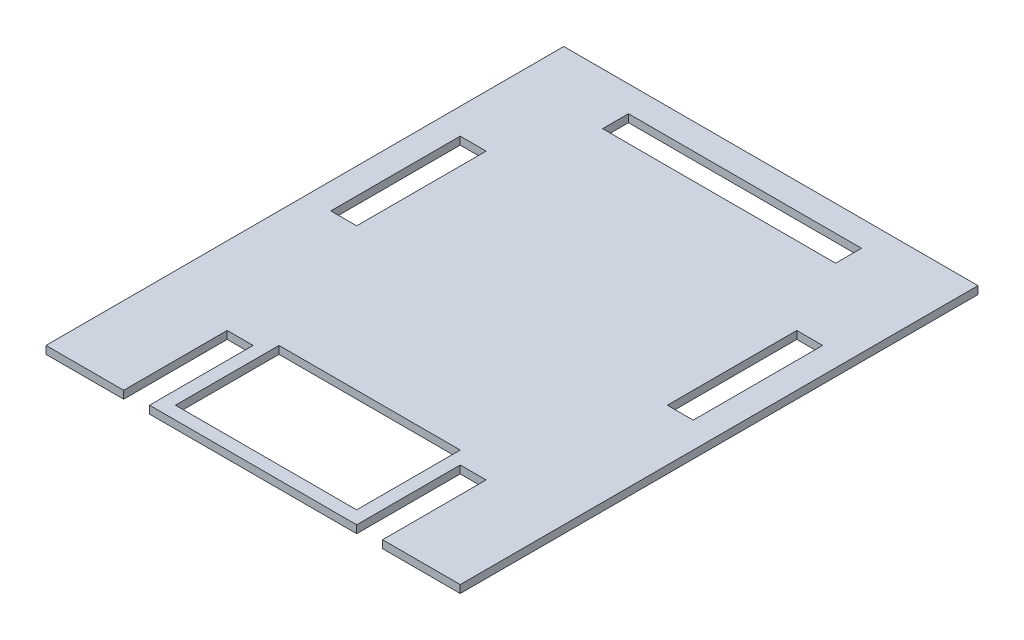
ISO-10303-21;
HEADER;
FILE_DESCRIPTION(('STEP AP214'),'2;1');
FILE_NAME('part.step','',(''),(''),'','','');
FILE_SCHEMA(('AUTOMOTIVE_DESIGN { 1 0 10303 214 1 1 1 1 }'));
ENDSEC;
DATA;
#1=APPLICATION_CONTEXT('core data for automotive mechanical design processes');
#2=APPLICATION_PROTOCOL_DEFINITION('international standard','automotive_design',2000,#1);
#3=PRODUCT_CONTEXT('',#1,'mechanical');
#4=PRODUCT('Part','Part','',(#3));
#5=PRODUCT_RELATED_PRODUCT_CATEGORY('part','',(#4));
#6=PRODUCT_DEFINITION_FORMATION('','',#4);
#7=PRODUCT_DEFINITION_CONTEXT('part definition',#1,'design');
#8=PRODUCT_DEFINITION('design','',#6,#7);
#9=PRODUCT_DEFINITION_SHAPE('','',#8);
#10=(LENGTH_UNIT() NAMED_UNIT(*) SI_UNIT(.MILLI.,.METRE.));
#11=(NAMED_UNIT(*) PLANE_ANGLE_UNIT() SI_UNIT($,.RADIAN.));
#12=(NAMED_UNIT(*) SI_UNIT($,.STERADIAN.) SOLID_ANGLE_UNIT());
#13=UNCERTAINTY_MEASURE_WITH_UNIT(LENGTH_MEASURE(1.E-05),#10,'distance_accuracy_value','');
#14=(GEOMETRIC_REPRESENTATION_CONTEXT(3) GLOBAL_UNCERTAINTY_ASSIGNED_CONTEXT((#13)) GLOBAL_UNIT_ASSIGNED_CONTEXT((#10,
#11,#12)) REPRESENTATION_CONTEXT('',''));
#15=CARTESIAN_POINT('',(0.,0.,0.));
#16=DIRECTION('',(0.,0.,1.));
#17=DIRECTION('',(1.,0.,0.));
#18=AXIS2_PLACEMENT_3D('',#15,#16,#17);
#19=CARTESIAN_POINT('',(0.,3.,-41.2685337726524));
#20=DIRECTION('',(0.,0.,1.));
#21=DIRECTION('',(1.,0.,0.));
#22=AXIS2_PLACEMENT_3D('',#19,#20,#21);
#23=PLANE('',#22);
#24=DIRECTION('',(-1.,0.,0.));
#25=VECTOR('',#24,1.);
#26=CARTESIAN_POINT('',(0.,0.,-41.2685337726524));
#27=LINE('',#26,#25);
#28=CARTESIAN_POINT('',(-89.0609555189457,0.,-41.2685337726524));
#29=VERTEX_POINT('',#28);
#30=CARTESIAN_POINT('',(-99.0609555189457,0.,-41.2685337726524));
#31=VERTEX_POINT('',#30);
#32=EDGE_CURVE('E385',#29,#31,#27,.T.);
#33=ORIENTED_EDGE('',*,*,#32,.F.);
#34=DIRECTION('',(0.,-1.,0.));
#35=VECTOR('',#34,1.);
#36=CARTESIAN_POINT('',(-89.0609555189457,3.,-41.2685337726524));
#37=LINE('',#36,#35);
#38=CARTESIAN_POINT('',(-89.0609555189457,3.,-41.2685337726524));
#39=VERTEX_POINT('',#38);
#40=EDGE_CURVE('E11',#39,#29,#37,.T.);
#41=ORIENTED_EDGE('',*,*,#40,.F.);
#42=DIRECTION('',(-1.,0.,0.));
#43=VECTOR('',#42,1.);
#44=CARTESIAN_POINT('',(0.,3.,-41.2685337726524));
#45=LINE('',#44,#43);
#46=CARTESIAN_POINT('',(-99.0609555189457,3.,-41.2685337726524));
#47=VERTEX_POINT('',#46);
#48=EDGE_CURVE('E240',#39,#47,#45,.T.);
#49=ORIENTED_EDGE('',*,*,#48,.T.);
#50=DIRECTION('',(0.,-1.,0.));
#51=VECTOR('',#50,1.);
#52=CARTESIAN_POINT('',(-99.0609555189457,3.,-41.2685337726524));
#53=LINE('',#52,#51);
#54=EDGE_CURVE('E54',#47,#31,#53,.T.);
#55=ORIENTED_EDGE('',*,*,#54,.T.);
#56=EDGE_LOOP('',(#33,#41,#49,#55));
#57=FACE_BOUND('',#56,.T.);
#58=ADVANCED_FACE('F35',(#57),#23,.T.);
#59=CARTESIAN_POINT('',(-89.0609555189457,3.,0.));
#60=DIRECTION('',(1.,0.,0.));
#61=DIRECTION('',(0.,0.,-1.));
#62=AXIS2_PLACEMENT_3D('',#59,#60,#61);
#63=PLANE('',#62);
#64=DIRECTION('',(0.,0.,1.));
#65=VECTOR('',#64,1.);
#66=CARTESIAN_POINT('',(-89.0609555189457,0.,0.));
#67=LINE('',#66,#65);
#68=CARTESIAN_POINT('',(-89.0609555189457,0.,8.73146622734762));
#69=VERTEX_POINT('',#68);
#70=EDGE_CURVE('E245',#29,#69,#67,.T.);
#71=ORIENTED_EDGE('',*,*,#70,.T.);
#72=DIRECTION('',(0.,-1.,0.));
#73=VECTOR('',#72,1.);
#74=CARTESIAN_POINT('',(-89.0609555189457,3.,8.73146622734762));
#75=LINE('',#74,#73);
#76=CARTESIAN_POINT('',(-89.0609555189457,3.,8.73146622734762));
#77=VERTEX_POINT('',#76);
#78=EDGE_CURVE('E45',#77,#69,#75,.T.);
#79=ORIENTED_EDGE('',*,*,#78,.F.);
#80=DIRECTION('',(0.,0.,1.));
#81=VECTOR('',#80,1.);
#82=CARTESIAN_POINT('',(-89.0609555189457,3.,0.));
#83=LINE('',#82,#81);
#84=EDGE_CURVE('E235',#39,#77,#83,.T.);
#85=ORIENTED_EDGE('',*,*,#84,.F.);
#86=ORIENTED_EDGE('',*,*,#40,.T.);
#87=EDGE_LOOP('',(#71,#79,#85,#86));
#88=FACE_BOUND('',#87,.T.);
#89=ADVANCED_FACE('F243',(#88),#63,.F.);
#90=CARTESIAN_POINT('',(0.,3.,8.73146622734762));
#91=DIRECTION('',(0.,0.,1.));
#92=DIRECTION('',(1.,0.,0.));
#93=AXIS2_PLACEMENT_3D('',#90,#91,#92);
#94=PLANE('',#93);
#95=DIRECTION('',(-1.,0.,0.));
#96=VECTOR('',#95,1.);
#97=CARTESIAN_POINT('',(0.,0.,8.73146622734762));
#98=LINE('',#97,#96);
#99=CARTESIAN_POINT('',(-99.0609555189457,0.,8.73146622734762));
#100=VERTEX_POINT('',#99);
#101=EDGE_CURVE('E388',#69,#100,#98,.T.);
#102=ORIENTED_EDGE('',*,*,#101,.T.);
#103=DIRECTION('',(0.,-1.,0.));
#104=VECTOR('',#103,1.);
#105=CARTESIAN_POINT('',(-99.0609555189457,3.,8.73146622734762));
#106=LINE('',#105,#104);
#107=CARTESIAN_POINT('',(-99.0609555189457,3.,8.73146622734762));
#108=VERTEX_POINT('',#107);
#109=EDGE_CURVE('E140',#108,#100,#106,.T.);
#110=ORIENTED_EDGE('',*,*,#109,.F.);
#111=DIRECTION('',(-1.,0.,0.));
#112=VECTOR('',#111,1.);
#113=CARTESIAN_POINT('',(0.,3.,8.73146622734762));
#114=LINE('',#113,#112);
#115=EDGE_CURVE('E227',#77,#108,#114,.T.);
#116=ORIENTED_EDGE('',*,*,#115,.F.);
#117=ORIENTED_EDGE('',*,*,#78,.T.);
#118=EDGE_LOOP('',(#102,#110,#116,#117));
#119=FACE_BOUND('',#118,.T.);
#120=ADVANCED_FACE('F229',(#119),#94,.F.);
#121=CARTESIAN_POINT('',(0.,3.,-91.2685337726524));
#122=DIRECTION('',(0.,0.,-1.));
#123=DIRECTION('',(-1.,0.,0.));
#124=AXIS2_PLACEMENT_3D('',#121,#122,#123);
#125=PLANE('',#124);
#126=DIRECTION('',(1.,0.,0.));
#127=VECTOR('',#126,1.);
#128=CARTESIAN_POINT('',(0.,0.,-91.2685337726524));
#129=LINE('',#128,#127);
#130=CARTESIAN_POINT('',(-109.060955518946,0.,-91.2685337726524));
#131=VERTEX_POINT('',#130);
#132=CARTESIAN_POINT('',(50.9390444810544,0.,-91.2685337726524));
#133=VERTEX_POINT('',#132);
#134=EDGE_CURVE('E351',#131,#133,#129,.T.);
#135=ORIENTED_EDGE('',*,*,#134,.F.);
#136=DIRECTION('',(0.,-1.,0.));
#137=VECTOR('',#136,1.);
#138=CARTESIAN_POINT('',(-109.060955518946,3.,-91.2685337726524));
#139=LINE('',#138,#137);
#140=CARTESIAN_POINT('',(-109.060955518946,3.,-91.2685337726524));
#141=VERTEX_POINT('',#140);
#142=EDGE_CURVE('E277',#141,#131,#139,.T.);
#143=ORIENTED_EDGE('',*,*,#142,.F.);
#144=DIRECTION('',(1.,0.,0.));
#145=VECTOR('',#144,1.);
#146=CARTESIAN_POINT('',(0.,3.,-91.2685337726524));
#147=LINE('',#146,#145);
#148=CARTESIAN_POINT('',(50.9390444810544,3.,-91.2685337726524));
#149=VERTEX_POINT('',#148);
#150=EDGE_CURVE('E425',#141,#149,#147,.T.);
#151=ORIENTED_EDGE('',*,*,#150,.T.);
#152=DIRECTION('',(0.,-1.,0.));
#153=VECTOR('',#152,1.);
#154=CARTESIAN_POINT('',(50.9390444810544,3.,-91.2685337726524));
#155=LINE('',#154,#153);
#156=EDGE_CURVE('E250',#149,#133,#155,.T.);
#157=ORIENTED_EDGE('',*,*,#156,.T.);
#158=EDGE_LOOP('',(#135,#143,#151,#157));
#159=FACE_BOUND('',#158,.T.);
#160=ADVANCED_FACE('F522',(#159),#125,.T.);
#161=CARTESIAN_POINT('',(-109.060955518946,3.,0.));
#162=DIRECTION('',(1.,0.,0.));
#163=DIRECTION('',(0.,0.,-1.));
#164=AXIS2_PLACEMENT_3D('',#161,#162,#163);
#165=PLANE('',#164);
#166=DIRECTION('',(0.,0.,1.));
#167=VECTOR('',#166,1.);
#168=CARTESIAN_POINT('',(-109.060955518946,0.,0.));
#169=LINE('',#168,#167);
#170=CARTESIAN_POINT('',(-109.060955518946,0.,108.731466227348));
#171=VERTEX_POINT('',#170);
#172=EDGE_CURVE('E354',#131,#171,#169,.T.);
#173=ORIENTED_EDGE('',*,*,#172,.T.);
#174=DIRECTION('',(0.,-1.,0.));
#175=VECTOR('',#174,1.);
#176=CARTESIAN_POINT('',(-109.060955518946,3.,108.731466227348));
#177=LINE('',#176,#175);
#178=CARTESIAN_POINT('',(-109.060955518946,3.,108.731466227348));
#179=VERTEX_POINT('',#178);
#180=EDGE_CURVE('E274',#179,#171,#177,.T.);
#181=ORIENTED_EDGE('',*,*,#180,.F.);
#182=DIRECTION('',(0.,0.,1.));
#183=VECTOR('',#182,1.);
#184=CARTESIAN_POINT('',(-109.060955518946,3.,0.));
#185=LINE('',#184,#183);
#186=EDGE_CURVE('E428',#141,#179,#185,.T.);
#187=ORIENTED_EDGE('',*,*,#186,.F.);
#188=ORIENTED_EDGE('',*,*,#142,.T.);
#189=EDGE_LOOP('',(#173,#181,#187,#188));
#190=FACE_BOUND('',#189,.T.);
#191=ADVANCED_FACE('F518',(#190),#165,.F.);
#192=CARTESIAN_POINT('',(0.,3.,108.731466227348));
#193=DIRECTION('',(0.,0.,-1.));
#194=DIRECTION('',(-1.,0.,0.));
#195=AXIS2_PLACEMENT_3D('',#192,#193,#194);
#196=PLANE('',#195);
#197=DIRECTION('',(1.,0.,0.));
#198=VECTOR('',#197,1.);
#199=CARTESIAN_POINT('',(0.,0.,108.731466227348));
#200=LINE('',#199,#198);
#201=CARTESIAN_POINT('',(-79.0609555189456,0.,108.731466227348));
#202=VERTEX_POINT('',#201);
#203=EDGE_CURVE('E357',#171,#202,#200,.T.);
#204=ORIENTED_EDGE('',*,*,#203,.T.);
#205=DIRECTION('',(0.,-1.,0.));
#206=VECTOR('',#205,1.);
#207=CARTESIAN_POINT('',(-79.0609555189456,3.,108.731466227348));
#208=LINE('',#207,#206);
#209=CARTESIAN_POINT('',(-79.0609555189456,3.,108.731466227348));
#210=VERTEX_POINT('',#209);
#211=EDGE_CURVE('E271',#210,#202,#208,.T.);
#212=ORIENTED_EDGE('',*,*,#211,.F.);
#213=DIRECTION('',(1.,0.,0.));
#214=VECTOR('',#213,1.);
#215=CARTESIAN_POINT('',(0.,3.,108.731466227348));
#216=LINE('',#215,#214);
#217=EDGE_CURVE('E431',#179,#210,#216,.T.);
#218=ORIENTED_EDGE('',*,*,#217,.F.);
#219=ORIENTED_EDGE('',*,*,#180,.T.);
#220=EDGE_LOOP('',(#204,#212,#218,#219));
#221=FACE_BOUND('',#220,.T.);
#222=ADVANCED_FACE('F514',(#221),#196,.F.);
#223=CARTESIAN_POINT('',(-79.0609555189456,3.,0.));
#224=DIRECTION('',(-1.,0.,0.));
#225=DIRECTION('',(0.,0.,1.));
#226=AXIS2_PLACEMENT_3D('',#223,#224,#225);
#227=PLANE('',#226);
#228=DIRECTION('',(0.,0.,-1.));
#229=VECTOR('',#228,1.);
#230=CARTESIAN_POINT('',(-79.0609555189456,0.,0.));
#231=LINE('',#230,#229);
#232=CARTESIAN_POINT('',(-79.0609555189456,0.,68.7314662273476));
#233=VERTEX_POINT('',#232);
#234=EDGE_CURVE('E360',#202,#233,#231,.T.);
#235=ORIENTED_EDGE('',*,*,#234,.T.);
#236=DIRECTION('',(0.,-1.,0.));
#237=VECTOR('',#236,1.);
#238=CARTESIAN_POINT('',(-79.0609555189456,3.,68.7314662273476));
#239=LINE('',#238,#237);
#240=CARTESIAN_POINT('',(-79.0609555189456,3.,68.7314662273476));
#241=VERTEX_POINT('',#240);
#242=EDGE_CURVE('E268',#241,#233,#239,.T.);
#243=ORIENTED_EDGE('',*,*,#242,.F.);
#244=DIRECTION('',(0.,0.,-1.));
#245=VECTOR('',#244,1.);
#246=CARTESIAN_POINT('',(-79.0609555189456,3.,0.));
#247=LINE('',#246,#245);
#248=EDGE_CURVE('E434',#210,#241,#247,.T.);
#249=ORIENTED_EDGE('',*,*,#248,.F.);
#250=ORIENTED_EDGE('',*,*,#211,.T.);
#251=EDGE_LOOP('',(#235,#243,#249,#250));
#252=FACE_BOUND('',#251,.T.);
#253=ADVANCED_FACE('F510',(#252),#227,.F.);
#254=CARTESIAN_POINT('',(0.,3.,68.7314662273476));
#255=DIRECTION('',(0.,0.,-1.));
#256=DIRECTION('',(-1.,0.,0.));
#257=AXIS2_PLACEMENT_3D('',#254,#255,#256);
#258=PLANE('',#257);
#259=DIRECTION('',(1.,0.,0.));
#260=VECTOR('',#259,1.);
#261=CARTESIAN_POINT('',(0.,0.,68.7314662273476));
#262=LINE('',#261,#260);
#263=CARTESIAN_POINT('',(-69.0609555189456,0.,68.7314662273476));
#264=VERTEX_POINT('',#263);
#265=EDGE_CURVE('E363',#233,#264,#262,.T.);
#266=ORIENTED_EDGE('',*,*,#265,.T.);
#267=DIRECTION('',(0.,-1.,0.));
#268=VECTOR('',#267,1.);
#269=CARTESIAN_POINT('',(-69.0609555189456,3.,68.7314662273476));
#270=LINE('',#269,#268);
#271=CARTESIAN_POINT('',(-69.0609555189456,3.,68.7314662273476));
#272=VERTEX_POINT('',#271);
#273=EDGE_CURVE('E266',#272,#264,#270,.T.);
#274=ORIENTED_EDGE('',*,*,#273,.F.);
#275=DIRECTION('',(1.,0.,0.));
#276=VECTOR('',#275,1.);
#277=CARTESIAN_POINT('',(0.,3.,68.7314662273476));
#278=LINE('',#277,#276);
#279=EDGE_CURVE('E437',#241,#272,#278,.T.);
#280=ORIENTED_EDGE('',*,*,#279,.F.);
#281=ORIENTED_EDGE('',*,*,#242,.T.);
#282=EDGE_LOOP('',(#266,#274,#280,#281));
#283=FACE_BOUND('',#282,.T.);
#284=ADVANCED_FACE('F506',(#283),#258,.F.);
#285=CARTESIAN_POINT('',(-69.0609555189456,3.,0.));
#286=DIRECTION('',(-1.,0.,0.));
#287=DIRECTION('',(0.,0.,1.));
#288=AXIS2_PLACEMENT_3D('',#285,#286,#287);
#289=PLANE('',#288);
#290=DIRECTION('',(0.,0.,-1.));
#291=VECTOR('',#290,1.);
#292=CARTESIAN_POINT('',(-69.0609555189456,0.,0.));
#293=LINE('',#292,#291);
#294=CARTESIAN_POINT('',(-69.0609555189456,0.,108.731466227348));
#295=VERTEX_POINT('',#294);
#296=EDGE_CURVE('E366',#295,#264,#293,.T.);
#297=ORIENTED_EDGE('',*,*,#296,.F.);
#298=DIRECTION('',(0.,-1.,0.));
#299=VECTOR('',#298,1.);
#300=CARTESIAN_POINT('',(-69.0609555189456,3.,108.731466227348));
#301=LINE('',#300,#299);
#302=CARTESIAN_POINT('',(-69.0609555189456,3.,108.731466227348));
#303=VERTEX_POINT('',#302);
#304=EDGE_CURVE('E264',#303,#295,#301,.T.);
#305=ORIENTED_EDGE('',*,*,#304,.F.);
#306=DIRECTION('',(0.,0.,-1.));
#307=VECTOR('',#306,1.);
#308=CARTESIAN_POINT('',(-69.0609555189456,3.,0.));
#309=LINE('',#308,#307);
#310=EDGE_CURVE('E439',#303,#272,#309,.T.);
#311=ORIENTED_EDGE('',*,*,#310,.T.);
#312=ORIENTED_EDGE('',*,*,#273,.T.);
#313=EDGE_LOOP('',(#297,#305,#311,#312));
#314=FACE_BOUND('',#313,.T.);
#315=ADVANCED_FACE('F503',(#314),#289,.T.);
#316=CARTESIAN_POINT('',(0.,3.,108.731466227348));
#317=DIRECTION('',(0.,0.,-1.));
#318=DIRECTION('',(-1.,0.,0.));
#319=AXIS2_PLACEMENT_3D('',#316,#317,#318);
#320=PLANE('',#319);
#321=DIRECTION('',(1.,0.,0.));
#322=VECTOR('',#321,1.);
#323=CARTESIAN_POINT('',(0.,0.,108.731466227348));
#324=LINE('',#323,#322);
#325=CARTESIAN_POINT('',(10.9390444810543,0.,108.731466227348));
#326=VERTEX_POINT('',#325);
#327=EDGE_CURVE('E369',#295,#326,#324,.T.);
#328=ORIENTED_EDGE('',*,*,#327,.T.);
#329=DIRECTION('',(0.,-1.,0.));
#330=VECTOR('',#329,1.);
#331=CARTESIAN_POINT('',(10.9390444810543,3.,108.731466227348));
#332=LINE('',#331,#330);
#333=CARTESIAN_POINT('',(10.9390444810543,3.,108.731466227348));
#334=VERTEX_POINT('',#333);
#335=EDGE_CURVE('E261',#334,#326,#332,.T.);
#336=ORIENTED_EDGE('',*,*,#335,.F.);
#337=DIRECTION('',(1.,0.,0.));
#338=VECTOR('',#337,1.);
#339=CARTESIAN_POINT('',(0.,3.,108.731466227348));
#340=LINE('',#339,#338);
#341=EDGE_CURVE('E442',#303,#334,#340,.T.);
#342=ORIENTED_EDGE('',*,*,#341,.F.);
#343=ORIENTED_EDGE('',*,*,#304,.T.);
#344=EDGE_LOOP('',(#328,#336,#342,#343));
#345=FACE_BOUND('',#344,.T.);
#346=ADVANCED_FACE('F491',(#345),#320,.F.);
#347=CARTESIAN_POINT('',(10.9390444810543,3.,0.));
#348=DIRECTION('',(-1.,0.,0.));
#349=DIRECTION('',(0.,0.,1.));
#350=AXIS2_PLACEMENT_3D('',#347,#348,#349);
#351=PLANE('',#350);
#352=DIRECTION('',(0.,0.,-1.));
#353=VECTOR('',#352,1.);
#354=CARTESIAN_POINT('',(10.9390444810543,0.,0.));
#355=LINE('',#354,#353);
#356=CARTESIAN_POINT('',(10.9390444810543,0.,68.7314662273476));
#357=VERTEX_POINT('',#356);
#358=EDGE_CURVE('E372',#326,#357,#355,.T.);
#359=ORIENTED_EDGE('',*,*,#358,.T.);
#360=DIRECTION('',(0.,-1.,0.));
#361=VECTOR('',#360,1.);
#362=CARTESIAN_POINT('',(10.9390444810543,3.,68.7314662273476));
#363=LINE('',#362,#361);
#364=CARTESIAN_POINT('',(10.9390444810543,3.,68.7314662273476));
#365=VERTEX_POINT('',#364);
#366=EDGE_CURVE('E259',#365,#357,#363,.T.);
#367=ORIENTED_EDGE('',*,*,#366,.F.);
#368=DIRECTION('',(0.,0.,-1.));
#369=VECTOR('',#368,1.);
#370=CARTESIAN_POINT('',(10.9390444810543,3.,0.));
#371=LINE('',#370,#369);
#372=EDGE_CURVE('E445',#334,#365,#371,.T.);
#373=ORIENTED_EDGE('',*,*,#372,.F.);
#374=ORIENTED_EDGE('',*,*,#335,.T.);
#375=EDGE_LOOP('',(#359,#367,#373,#374));
#376=FACE_BOUND('',#375,.T.);
#377=ADVANCED_FACE('F498',(#376),#351,.F.);
#378=CARTESIAN_POINT('',(0.,3.,68.7314662273476));
#379=DIRECTION('',(0.,0.,1.));
#380=DIRECTION('',(1.,0.,0.));
#381=AXIS2_PLACEMENT_3D('',#378,#379,#380);
#382=PLANE('',#381);
#383=DIRECTION('',(-1.,0.,0.));
#384=VECTOR('',#383,1.);
#385=CARTESIAN_POINT('',(0.,0.,68.7314662273476));
#386=LINE('',#385,#384);
#387=CARTESIAN_POINT('',(20.9390444810543,0.,68.7314662273476));
#388=VERTEX_POINT('',#387);
#389=EDGE_CURVE('E376',#388,#357,#386,.T.);
#390=ORIENTED_EDGE('',*,*,#389,.F.);
#391=DIRECTION('',(0.,-1.,0.));
#392=VECTOR('',#391,1.);
#393=CARTESIAN_POINT('',(20.9390444810543,3.,68.7314662273476));
#394=LINE('',#393,#392);
#395=CARTESIAN_POINT('',(20.9390444810543,3.,68.7314662273476));
#396=VERTEX_POINT('',#395);
#397=EDGE_CURVE('E257',#396,#388,#394,.T.);
#398=ORIENTED_EDGE('',*,*,#397,.F.);
#399=DIRECTION('',(-1.,0.,0.));
#400=VECTOR('',#399,1.);
#401=CARTESIAN_POINT('',(0.,3.,68.7314662273476));
#402=LINE('',#401,#400);
#403=EDGE_CURVE('E448',#396,#365,#402,.T.);
#404=ORIENTED_EDGE('',*,*,#403,.T.);
#405=ORIENTED_EDGE('',*,*,#366,.T.);
#406=EDGE_LOOP('',(#390,#398,#404,#405));
#407=FACE_BOUND('',#406,.T.);
#408=ADVANCED_FACE('F494',(#407),#382,.T.);
#409=CARTESIAN_POINT('',(20.9390444810543,3.,0.));
#410=DIRECTION('',(-1.,0.,0.));
#411=DIRECTION('',(0.,0.,1.));
#412=AXIS2_PLACEMENT_3D('',#409,#410,#411);
#413=PLANE('',#412);
#414=DIRECTION('',(0.,0.,-1.));
#415=VECTOR('',#414,1.);
#416=CARTESIAN_POINT('',(20.9390444810543,0.,0.));
#417=LINE('',#416,#415);
#418=CARTESIAN_POINT('',(20.9390444810543,0.,108.731466227348));
#419=VERTEX_POINT('',#418);
#420=EDGE_CURVE('E379',#419,#388,#417,.T.);
#421=ORIENTED_EDGE('',*,*,#420,.F.);
#422=DIRECTION('',(0.,-1.,0.));
#423=VECTOR('',#422,1.);
#424=CARTESIAN_POINT('',(20.9390444810543,3.,108.731466227348));
#425=LINE('',#424,#423);
#426=CARTESIAN_POINT('',(20.9390444810543,3.,108.731466227348));
#427=VERTEX_POINT('',#426);
#428=EDGE_CURVE('E255',#427,#419,#425,.T.);
#429=ORIENTED_EDGE('',*,*,#428,.F.);
#430=DIRECTION('',(0.,0.,-1.));
#431=VECTOR('',#430,1.);
#432=CARTESIAN_POINT('',(20.9390444810543,3.,0.));
#433=LINE('',#432,#431);
#434=EDGE_CURVE('E451',#427,#396,#433,.T.);
#435=ORIENTED_EDGE('',*,*,#434,.T.);
#436=ORIENTED_EDGE('',*,*,#397,.T.);
#437=EDGE_LOOP('',(#421,#429,#435,#436));
#438=FACE_BOUND('',#437,.T.);
#439=ADVANCED_FACE('F489',(#438),#413,.T.);
#440=CARTESIAN_POINT('',(50.9390444810544,0.,108.731466227348));
#441=VERTEX_POINT('',#440);
#442=EDGE_CURVE('E373',#419,#441,#324,.T.);
#443=ORIENTED_EDGE('',*,*,#442,.T.);
#444=DIRECTION('',(0.,-1.,0.));
#445=VECTOR('',#444,1.);
#446=CARTESIAN_POINT('',(50.9390444810544,3.,108.731466227348));
#447=LINE('',#446,#445);
#448=CARTESIAN_POINT('',(50.9390444810544,3.,108.731466227348));
#449=VERTEX_POINT('',#448);
#450=EDGE_CURVE('E252',#449,#441,#447,.T.);
#451=ORIENTED_EDGE('',*,*,#450,.F.);
#452=EDGE_CURVE('E446',#427,#449,#340,.T.);
#453=ORIENTED_EDGE('',*,*,#452,.F.);
#454=ORIENTED_EDGE('',*,*,#428,.T.);
#455=EDGE_LOOP('',(#443,#451,#453,#454));
#456=FACE_BOUND('',#455,.T.);
#457=ADVANCED_FACE('F485',(#456),#320,.F.);
#458=CARTESIAN_POINT('',(0.,3.,-41.2685337726524));
#459=DIRECTION('',(0.,0.,-1.));
#460=DIRECTION('',(-1.,0.,0.));
#461=AXIS2_PLACEMENT_3D('',#458,#459,#460);
#462=PLANE('',#461);
#463=DIRECTION('',(1.,0.,0.));
#464=VECTOR('',#463,1.);
#465=CARTESIAN_POINT('',(0.,0.,-41.2685337726524));
#466=LINE('',#465,#464);
#467=CARTESIAN_POINT('',(30.9390444810544,0.,-41.2685337726524));
#468=VERTEX_POINT('',#467);
#469=CARTESIAN_POINT('',(40.9390444810544,0.,-41.2685337726524));
#470=VERTEX_POINT('',#469);
#471=EDGE_CURVE('E339',#468,#470,#466,.T.);
#472=ORIENTED_EDGE('',*,*,#471,.T.);
#473=DIRECTION('',(0.,-1.,0.));
#474=VECTOR('',#473,1.);
#475=CARTESIAN_POINT('',(40.9390444810544,3.,-41.2685337726524));
#476=LINE('',#475,#474);
#477=CARTESIAN_POINT('',(40.9390444810544,3.,-41.2685337726524));
#478=VERTEX_POINT('',#477);
#479=EDGE_CURVE('E253',#478,#470,#476,.T.);
#480=ORIENTED_EDGE('',*,*,#479,.F.);
#481=DIRECTION('',(1.,0.,0.));
#482=VECTOR('',#481,1.);
#483=CARTESIAN_POINT('',(0.,3.,-41.2685337726524));
#484=LINE('',#483,#482);
#485=CARTESIAN_POINT('',(30.9390444810544,3.,-41.2685337726524));
#486=VERTEX_POINT('',#485);
#487=EDGE_CURVE('E414',#486,#478,#484,.T.);
#488=ORIENTED_EDGE('',*,*,#487,.F.);
#489=DIRECTION('',(0.,-1.,0.));
#490=VECTOR('',#489,1.);
#491=CARTESIAN_POINT('',(30.9390444810544,3.,-41.2685337726524));
#492=LINE('',#491,#490);
#493=EDGE_CURVE('E279',#486,#468,#492,.T.);
#494=ORIENTED_EDGE('',*,*,#493,.T.);
#495=EDGE_LOOP('',(#472,#480,#488,#494));
#496=FACE_BOUND('',#495,.T.);
#497=ADVANCED_FACE('F488',(#496),#462,.F.);
#498=CARTESIAN_POINT('',(40.9390444810544,3.,0.));
#499=DIRECTION('',(1.,0.,0.));
#500=DIRECTION('',(0.,0.,-1.));
#501=AXIS2_PLACEMENT_3D('',#498,#499,#500);
#502=PLANE('',#501);
#503=DIRECTION('',(0.,0.,1.));
#504=VECTOR('',#503,1.);
#505=CARTESIAN_POINT('',(40.9390444810544,0.,0.));
#506=LINE('',#505,#504);
#507=CARTESIAN_POINT('',(40.9390444810544,0.,8.73146622734762));
#508=VERTEX_POINT('',#507);
#509=EDGE_CURVE('E342',#470,#508,#506,.T.);
#510=ORIENTED_EDGE('',*,*,#509,.T.);
#511=DIRECTION('',(0.,-1.,0.));
#512=VECTOR('',#511,1.);
#513=CARTESIAN_POINT('',(40.9390444810544,3.,8.73146622734762));
#514=LINE('',#513,#512);
#515=CARTESIAN_POINT('',(40.9390444810544,3.,8.73146622734762));
#516=VERTEX_POINT('',#515);
#517=EDGE_CURVE('E284',#516,#508,#514,.T.);
#518=ORIENTED_EDGE('',*,*,#517,.F.);
#519=DIRECTION('',(0.,0.,1.));
#520=VECTOR('',#519,1.);
#521=CARTESIAN_POINT('',(40.9390444810544,3.,0.));
#522=LINE('',#521,#520);
#523=EDGE_CURVE('E417',#478,#516,#522,.T.);
#524=ORIENTED_EDGE('',*,*,#523,.F.);
#525=ORIENTED_EDGE('',*,*,#479,.T.);
#526=EDGE_LOOP('',(#510,#518,#524,#525));
#527=FACE_BOUND('',#526,.T.);
#528=ADVANCED_FACE('F534',(#527),#502,.F.);
#529=CARTESIAN_POINT('',(0.,3.,8.73146622734762));
#530=DIRECTION('',(0.,0.,-1.));
#531=DIRECTION('',(-1.,0.,0.));
#532=AXIS2_PLACEMENT_3D('',#529,#530,#531);
#533=PLANE('',#532);
#534=DIRECTION('',(1.,0.,0.));
#535=VECTOR('',#534,1.);
#536=CARTESIAN_POINT('',(0.,0.,8.73146622734762));
#537=LINE('',#536,#535);
#538=CARTESIAN_POINT('',(30.9390444810544,0.,8.73146622734762));
#539=VERTEX_POINT('',#538);
#540=EDGE_CURVE('E345',#539,#508,#537,.T.);
#541=ORIENTED_EDGE('',*,*,#540,.F.);
#542=DIRECTION('',(0.,-1.,0.));
#543=VECTOR('',#542,1.);
#544=CARTESIAN_POINT('',(30.9390444810544,3.,8.73146622734762));
#545=LINE('',#544,#543);
#546=CARTESIAN_POINT('',(30.9390444810544,3.,8.73146622734762));
#547=VERTEX_POINT('',#546);
#548=EDGE_CURVE('E281',#547,#539,#545,.T.);
#549=ORIENTED_EDGE('',*,*,#548,.F.);
#550=DIRECTION('',(1.,0.,0.));
#551=VECTOR('',#550,1.);
#552=CARTESIAN_POINT('',(0.,3.,8.73146622734762));
#553=LINE('',#552,#551);
#554=EDGE_CURVE('E419',#547,#516,#553,.T.);
#555=ORIENTED_EDGE('',*,*,#554,.T.);
#556=ORIENTED_EDGE('',*,*,#517,.T.);
#557=EDGE_LOOP('',(#541,#549,#555,#556));
#558=FACE_BOUND('',#557,.T.);
#559=ADVANCED_FACE('F530',(#558),#533,.T.);
#560=CARTESIAN_POINT('',(-64.0609555189456,3.,0.));
#561=DIRECTION('',(1.,0.,0.));
#562=DIRECTION('',(0.,0.,-1.));
#563=AXIS2_PLACEMENT_3D('',#560,#561,#562);
#564=PLANE('',#563);
#565=DIRECTION('',(0.,0.,1.));
#566=VECTOR('',#565,1.);
#567=CARTESIAN_POINT('',(-64.0609555189456,0.,0.));
#568=LINE('',#567,#566);
#569=CARTESIAN_POINT('',(-64.0609555189456,0.,63.7314662273476));
#570=VERTEX_POINT('',#569);
#571=CARTESIAN_POINT('',(-64.0609555189456,0.,103.731466227348));
#572=VERTEX_POINT('',#571);
#573=EDGE_CURVE('E327',#570,#572,#568,.T.);
#574=ORIENTED_EDGE('',*,*,#573,.F.);
#575=DIRECTION('',(0.,-1.,0.));
#576=VECTOR('',#575,1.);
#577=CARTESIAN_POINT('',(-64.0609555189456,3.,63.7314662273476));
#578=LINE('',#577,#576);
#579=CARTESIAN_POINT('',(-64.0609555189456,3.,63.7314662273476));
#580=VERTEX_POINT('',#579);
#581=EDGE_CURVE('E282',#580,#570,#578,.T.);
#582=ORIENTED_EDGE('',*,*,#581,.F.);
#583=DIRECTION('',(0.,0.,1.));
#584=VECTOR('',#583,1.);
#585=CARTESIAN_POINT('',(-64.0609555189456,3.,0.));
#586=LINE('',#585,#584);
#587=CARTESIAN_POINT('',(-64.0609555189456,3.,103.731466227348));
#588=VERTEX_POINT('',#587);
#589=EDGE_CURVE('E403',#580,#588,#586,.T.);
#590=ORIENTED_EDGE('',*,*,#589,.T.);
#591=DIRECTION('',(0.,-1.,0.));
#592=VECTOR('',#591,1.);
#593=CARTESIAN_POINT('',(-64.0609555189456,3.,103.731466227348));
#594=LINE('',#593,#592);
#595=EDGE_CURVE('E288',#588,#572,#594,.T.);
#596=ORIENTED_EDGE('',*,*,#595,.T.);
#597=EDGE_LOOP('',(#574,#582,#590,#596));
#598=FACE_BOUND('',#597,.T.);
#599=ADVANCED_FACE('F533',(#598),#564,.T.);
#600=CARTESIAN_POINT('',(0.,3.,63.7314662273476));
#601=DIRECTION('',(0.,0.,-1.));
#602=DIRECTION('',(-1.,0.,0.));
#603=AXIS2_PLACEMENT_3D('',#600,#601,#602);
#604=PLANE('',#603);
#605=DIRECTION('',(1.,0.,0.));
#606=VECTOR('',#605,1.);
#607=CARTESIAN_POINT('',(0.,0.,63.7314662273476));
#608=LINE('',#607,#606);
#609=CARTESIAN_POINT('',(5.93904448105438,0.,63.7314662273476));
#610=VERTEX_POINT('',#609);
#611=EDGE_CURVE('E330',#570,#610,#608,.T.);
#612=ORIENTED_EDGE('',*,*,#611,.T.);
#613=DIRECTION('',(0.,-1.,0.));
#614=VECTOR('',#613,1.);
#615=CARTESIAN_POINT('',(5.93904448105438,3.,63.7314662273476));
#616=LINE('',#615,#614);
#617=CARTESIAN_POINT('',(5.93904448105438,3.,63.7314662273476));
#618=VERTEX_POINT('',#617);
#619=EDGE_CURVE('E292',#618,#610,#616,.T.);
#620=ORIENTED_EDGE('',*,*,#619,.F.);
#621=DIRECTION('',(1.,0.,0.));
#622=VECTOR('',#621,1.);
#623=CARTESIAN_POINT('',(0.,3.,63.7314662273476));
#624=LINE('',#623,#622);
#625=EDGE_CURVE('E406',#580,#618,#624,.T.);
#626=ORIENTED_EDGE('',*,*,#625,.F.);
#627=ORIENTED_EDGE('',*,*,#581,.T.);
#628=EDGE_LOOP('',(#612,#620,#626,#627));
#629=FACE_BOUND('',#628,.T.);
#630=ADVANCED_FACE('F548',(#629),#604,.F.);
#631=CARTESIAN_POINT('',(5.93904448105437,3.,0.));
#632=DIRECTION('',(1.,0.,0.));
#633=DIRECTION('',(0.,0.,-1.));
#634=AXIS2_PLACEMENT_3D('',#631,#632,#633);
#635=PLANE('',#634);
#636=DIRECTION('',(0.,0.,1.));
#637=VECTOR('',#636,1.);
#638=CARTESIAN_POINT('',(5.93904448105437,0.,0.));
#639=LINE('',#638,#637);
#640=CARTESIAN_POINT('',(5.93904448105439,0.,103.731466227348));
#641=VERTEX_POINT('',#640);
#642=EDGE_CURVE('E333',#610,#641,#639,.T.);
#643=ORIENTED_EDGE('',*,*,#642,.T.);
#644=DIRECTION('',(0.,-1.,0.));
#645=VECTOR('',#644,1.);
#646=CARTESIAN_POINT('',(5.93904448105439,3.,103.731466227348));
#647=LINE('',#646,#645);
#648=CARTESIAN_POINT('',(5.93904448105439,3.,103.731466227348));
#649=VERTEX_POINT('',#648);
#650=EDGE_CURVE('E290',#649,#641,#647,.T.);
#651=ORIENTED_EDGE('',*,*,#650,.F.);
#652=DIRECTION('',(0.,0.,1.));
#653=VECTOR('',#652,1.);
#654=CARTESIAN_POINT('',(5.93904448105437,3.,0.));
#655=LINE('',#654,#653);
#656=EDGE_CURVE('E409',#618,#649,#655,.T.);
#657=ORIENTED_EDGE('',*,*,#656,.F.);
#658=ORIENTED_EDGE('',*,*,#619,.T.);
#659=EDGE_LOOP('',(#643,#651,#657,#658));
#660=FACE_BOUND('',#659,.T.);
#661=ADVANCED_FACE('F545',(#660),#635,.F.);
#662=CARTESIAN_POINT('',(-74.0609555189456,3.,0.));
#663=DIRECTION('',(1.,0.,0.));
#664=DIRECTION('',(0.,0.,-1.));
#665=AXIS2_PLACEMENT_3D('',#662,#663,#664);
#666=PLANE('',#665);
#667=DIRECTION('',(0.,0.,1.));
#668=VECTOR('',#667,1.);
#669=CARTESIAN_POINT('',(-74.0609555189456,0.,0.));
#670=LINE('',#669,#668);
#671=CARTESIAN_POINT('',(-74.0609555189456,0.,-81.2685337726524));
#672=VERTEX_POINT('',#671);
#673=CARTESIAN_POINT('',(-74.0609555189456,0.,-71.2685337726524));
#674=VERTEX_POINT('',#673);
#675=EDGE_CURVE('E317',#672,#674,#670,.T.);
#676=ORIENTED_EDGE('',*,*,#675,.F.);
#677=DIRECTION('',(0.,-1.,0.));
#678=VECTOR('',#677,1.);
#679=CARTESIAN_POINT('',(-74.0609555189456,3.,-81.2685337726524));
#680=LINE('',#679,#678);
#681=CARTESIAN_POINT('',(-74.0609555189456,3.,-81.2685337726524));
#682=VERTEX_POINT('',#681);
#683=EDGE_CURVE('E39',#682,#672,#680,.T.);
#684=ORIENTED_EDGE('',*,*,#683,.F.);
#685=DIRECTION('',(0.,0.,1.));
#686=VECTOR('',#685,1.);
#687=CARTESIAN_POINT('',(-74.0609555189456,3.,0.));
#688=LINE('',#687,#686);
#689=CARTESIAN_POINT('',(-74.0609555189456,3.,-71.2685337726524));
#690=VERTEX_POINT('',#689);
#691=EDGE_CURVE('E392',#682,#690,#688,.T.);
#692=ORIENTED_EDGE('',*,*,#691,.T.);
#693=DIRECTION('',(0.,-1.,0.));
#694=VECTOR('',#693,1.);
#695=CARTESIAN_POINT('',(-74.0609555189456,3.,-71.2685337726524));
#696=LINE('',#695,#694);
#697=EDGE_CURVE('E296',#690,#674,#696,.T.);
#698=ORIENTED_EDGE('',*,*,#697,.T.);
#699=EDGE_LOOP('',(#676,#684,#692,#698));
#700=FACE_BOUND('',#699,.T.);
#701=ADVANCED_FACE('F37',(#700),#666,.T.);
#702=CARTESIAN_POINT('',(0.,3.,-81.2685337726524));
#703=DIRECTION('',(0.,0.,-1.));
#704=DIRECTION('',(-1.,0.,0.));
#705=AXIS2_PLACEMENT_3D('',#702,#703,#704);
#706=PLANE('',#705);
#707=DIRECTION('',(1.,0.,0.));
#708=VECTOR('',#707,1.);
#709=CARTESIAN_POINT('',(0.,0.,-81.2685337726524));
#710=LINE('',#709,#708);
#711=CARTESIAN_POINT('',(15.9390444810543,0.,-81.2685337726524));
#712=VERTEX_POINT('',#711);
#713=EDGE_CURVE('E309',#672,#712,#710,.T.);
#714=ORIENTED_EDGE('',*,*,#713,.T.);
#715=DIRECTION('',(0.,-1.,0.));
#716=VECTOR('',#715,1.);
#717=CARTESIAN_POINT('',(15.9390444810543,3.,-81.2685337726524));
#718=LINE('',#717,#716);
#719=CARTESIAN_POINT('',(15.9390444810543,3.,-81.2685337726524));
#720=VERTEX_POINT('',#719);
#721=EDGE_CURVE('E299',#720,#712,#718,.T.);
#722=ORIENTED_EDGE('',*,*,#721,.F.);
#723=DIRECTION('',(1.,0.,0.));
#724=VECTOR('',#723,1.);
#725=CARTESIAN_POINT('',(0.,3.,-81.2685337726524));
#726=LINE('',#725,#724);
#727=EDGE_CURVE('E310',#682,#720,#726,.T.);
#728=ORIENTED_EDGE('',*,*,#727,.F.);
#729=ORIENTED_EDGE('',*,*,#683,.T.);
#730=EDGE_LOOP('',(#714,#722,#728,#729));
#731=FACE_BOUND('',#730,.T.);
#732=ADVANCED_FACE('F308',(#731),#706,.F.);
#733=CARTESIAN_POINT('',(15.9390444810543,3.,0.));
#734=DIRECTION('',(1.,0.,0.));
#735=DIRECTION('',(0.,0.,-1.));
#736=AXIS2_PLACEMENT_3D('',#733,#734,#735);
#737=PLANE('',#736);
#738=DIRECTION('',(0.,0.,1.));
#739=VECTOR('',#738,1.);
#740=CARTESIAN_POINT('',(15.9390444810543,0.,0.));
#741=LINE('',#740,#739);
#742=CARTESIAN_POINT('',(15.9390444810543,0.,-71.2685337726524));
#743=VERTEX_POINT('',#742);
#744=EDGE_CURVE('E319',#712,#743,#741,.T.);
#745=ORIENTED_EDGE('',*,*,#744,.T.);
#746=DIRECTION('',(0.,-1.,0.));
#747=VECTOR('',#746,1.);
#748=CARTESIAN_POINT('',(15.9390444810543,3.,-71.2685337726524));
#749=LINE('',#748,#747);
#750=CARTESIAN_POINT('',(15.9390444810543,3.,-71.2685337726524));
#751=VERTEX_POINT('',#750);
#752=EDGE_CURVE('E298',#751,#743,#749,.T.);
#753=ORIENTED_EDGE('',*,*,#752,.F.);
#754=DIRECTION('',(0.,0.,1.));
#755=VECTOR('',#754,1.);
#756=CARTESIAN_POINT('',(15.9390444810543,3.,0.));
#757=LINE('',#756,#755);
#758=EDGE_CURVE('E396',#720,#751,#757,.T.);
#759=ORIENTED_EDGE('',*,*,#758,.F.);
#760=ORIENTED_EDGE('',*,*,#721,.T.);
#761=EDGE_LOOP('',(#745,#753,#759,#760));
#762=FACE_BOUND('',#761,.T.);
#763=ADVANCED_FACE('F483',(#762),#737,.F.);
#764=CARTESIAN_POINT('',(50.9390444810544,3.,0.));
#765=DIRECTION('',(1.,0.,0.));
#766=DIRECTION('',(0.,0.,-1.));
#767=AXIS2_PLACEMENT_3D('',#764,#765,#766);
#768=PLANE('',#767);
#769=DIRECTION('',(0.,0.,1.));
#770=VECTOR('',#769,1.);
#771=CARTESIAN_POINT('',(50.9390444810544,0.,0.));
#772=LINE('',#771,#770);
#773=EDGE_CURVE('E382',#133,#441,#772,.T.);
#774=ORIENTED_EDGE('',*,*,#773,.F.);
#775=ORIENTED_EDGE('',*,*,#156,.F.);
#776=DIRECTION('',(0.,0.,1.));
#777=VECTOR('',#776,1.);
#778=CARTESIAN_POINT('',(50.9390444810544,3.,0.));
#779=LINE('',#778,#777);
#780=EDGE_CURVE('E454',#149,#449,#779,.T.);
#781=ORIENTED_EDGE('',*,*,#780,.T.);
#782=ORIENTED_EDGE('',*,*,#450,.T.);
#783=EDGE_LOOP('',(#774,#775,#781,#782));
#784=FACE_BOUND('',#783,.T.);
#785=ADVANCED_FACE('F479',(#784),#768,.T.);
#786=CARTESIAN_POINT('',(30.9390444810544,3.,0.));
#787=DIRECTION('',(1.,0.,0.));
#788=DIRECTION('',(0.,0.,-1.));
#789=AXIS2_PLACEMENT_3D('',#786,#787,#788);
#790=PLANE('',#789);
#791=DIRECTION('',(0.,0.,1.));
#792=VECTOR('',#791,1.);
#793=CARTESIAN_POINT('',(30.9390444810544,0.,0.));
#794=LINE('',#793,#792);
#795=EDGE_CURVE('E348',#468,#539,#794,.T.);
#796=ORIENTED_EDGE('',*,*,#795,.F.);
#797=ORIENTED_EDGE('',*,*,#493,.F.);
#798=DIRECTION('',(0.,0.,1.));
#799=VECTOR('',#798,1.);
#800=CARTESIAN_POINT('',(30.9390444810544,3.,0.));
#801=LINE('',#800,#799);
#802=EDGE_CURVE('E422',#486,#547,#801,.T.);
#803=ORIENTED_EDGE('',*,*,#802,.T.);
#804=ORIENTED_EDGE('',*,*,#548,.T.);
#805=EDGE_LOOP('',(#796,#797,#803,#804));
#806=FACE_BOUND('',#805,.T.);
#807=ADVANCED_FACE('F482',(#806),#790,.T.);
#808=CARTESIAN_POINT('',(0.,3.,103.731466227348));
#809=DIRECTION('',(0.,0.,-1.));
#810=DIRECTION('',(-1.,0.,0.));
#811=AXIS2_PLACEMENT_3D('',#808,#809,#810);
#812=PLANE('',#811);
#813=DIRECTION('',(1.,0.,0.));
#814=VECTOR('',#813,1.);
#815=CARTESIAN_POINT('',(0.,0.,103.731466227348));
#816=LINE('',#815,#814);
#817=EDGE_CURVE('E336',#572,#641,#816,.T.);
#818=ORIENTED_EDGE('',*,*,#817,.F.);
#819=ORIENTED_EDGE('',*,*,#595,.F.);
#820=DIRECTION('',(1.,0.,0.));
#821=VECTOR('',#820,1.);
#822=CARTESIAN_POINT('',(0.,3.,103.731466227348));
#823=LINE('',#822,#821);
#824=EDGE_CURVE('E411',#588,#649,#823,.T.);
#825=ORIENTED_EDGE('',*,*,#824,.T.);
#826=ORIENTED_EDGE('',*,*,#650,.T.);
#827=EDGE_LOOP('',(#818,#819,#825,#826));
#828=FACE_BOUND('',#827,.T.);
#829=ADVANCED_FACE('F467',(#828),#812,.T.);
#830=CARTESIAN_POINT('',(0.,3.,-71.2685337726524));
#831=DIRECTION('',(0.,0.,-1.));
#832=DIRECTION('',(-1.,0.,0.));
#833=AXIS2_PLACEMENT_3D('',#830,#831,#832);
#834=PLANE('',#833);
#835=DIRECTION('',(1.,0.,0.));
#836=VECTOR('',#835,1.);
#837=CARTESIAN_POINT('',(0.,0.,-71.2685337726524));
#838=LINE('',#837,#836);
#839=EDGE_CURVE('E325',#674,#743,#838,.T.);
#840=ORIENTED_EDGE('',*,*,#839,.F.);
#841=ORIENTED_EDGE('',*,*,#697,.F.);
#842=DIRECTION('',(1.,0.,0.));
#843=VECTOR('',#842,1.);
#844=CARTESIAN_POINT('',(0.,3.,-71.2685337726524));
#845=LINE('',#844,#843);
#846=EDGE_CURVE('E400',#690,#751,#845,.T.);
#847=ORIENTED_EDGE('',*,*,#846,.T.);
#848=ORIENTED_EDGE('',*,*,#752,.T.);
#849=EDGE_LOOP('',(#840,#841,#847,#848));
#850=FACE_BOUND('',#849,.T.);
#851=ADVANCED_FACE('F459',(#850),#834,.T.);
#852=CARTESIAN_POINT('',(-99.0609555189457,3.,0.));
#853=DIRECTION('',(1.,0.,0.));
#854=DIRECTION('',(0.,0.,-1.));
#855=AXIS2_PLACEMENT_3D('',#852,#853,#854);
#856=PLANE('',#855);
#857=DIRECTION('',(0.,0.,1.));
#858=VECTOR('',#857,1.);
#859=CARTESIAN_POINT('',(-99.0609555189457,0.,0.));
#860=LINE('',#859,#858);
#861=EDGE_CURVE('E390',#31,#100,#860,.T.);
#862=ORIENTED_EDGE('',*,*,#861,.F.);
#863=ORIENTED_EDGE('',*,*,#54,.F.);
#864=DIRECTION('',(0.,0.,1.));
#865=VECTOR('',#864,1.);
#866=CARTESIAN_POINT('',(-99.0609555189457,3.,0.));
#867=LINE('',#866,#865);
#868=EDGE_CURVE('E234',#47,#108,#867,.T.);
#869=ORIENTED_EDGE('',*,*,#868,.T.);
#870=ORIENTED_EDGE('',*,*,#109,.T.);
#871=EDGE_LOOP('',(#862,#863,#869,#870));
#872=FACE_BOUND('',#871,.T.);
#873=ADVANCED_FACE('F457',(#872),#856,.T.);
#874=CARTESIAN_POINT('',(0.,3.,0.));
#875=DIRECTION('',(0.,1.,0.));
#876=DIRECTION('',(0.,0.,1.));
#877=AXIS2_PLACEMENT_3D('',#874,#875,#876);
#878=PLANE('',#877);
#879=ORIENTED_EDGE('',*,*,#691,.F.);
#880=ORIENTED_EDGE('',*,*,#727,.T.);
#881=ORIENTED_EDGE('',*,*,#758,.T.);
#882=ORIENTED_EDGE('',*,*,#846,.F.);
#883=EDGE_LOOP('',(#879,#880,#881,#882));
#884=FACE_BOUND('',#883,.T.);
#885=ORIENTED_EDGE('',*,*,#589,.F.);
#886=ORIENTED_EDGE('',*,*,#625,.T.);
#887=ORIENTED_EDGE('',*,*,#656,.T.);
#888=ORIENTED_EDGE('',*,*,#824,.F.);
#889=EDGE_LOOP('',(#885,#886,#887,#888));
#890=FACE_BOUND('',#889,.T.);
#891=ORIENTED_EDGE('',*,*,#487,.T.);
#892=ORIENTED_EDGE('',*,*,#523,.T.);
#893=ORIENTED_EDGE('',*,*,#554,.F.);
#894=ORIENTED_EDGE('',*,*,#802,.F.);
#895=EDGE_LOOP('',(#891,#892,#893,#894));
#896=FACE_BOUND('',#895,.T.);
#897=ORIENTED_EDGE('',*,*,#150,.F.);
#898=ORIENTED_EDGE('',*,*,#186,.T.);
#899=ORIENTED_EDGE('',*,*,#217,.T.);
#900=ORIENTED_EDGE('',*,*,#248,.T.);
#901=ORIENTED_EDGE('',*,*,#279,.T.);
#902=ORIENTED_EDGE('',*,*,#310,.F.);
#903=ORIENTED_EDGE('',*,*,#341,.T.);
#904=ORIENTED_EDGE('',*,*,#372,.T.);
#905=ORIENTED_EDGE('',*,*,#403,.F.);
#906=ORIENTED_EDGE('',*,*,#434,.F.);
#907=ORIENTED_EDGE('',*,*,#452,.T.);
#908=ORIENTED_EDGE('',*,*,#780,.F.);
#909=EDGE_LOOP('',(#897,#898,#899,#900,#901,#902,#903,#904,#905,#906,#907,#908));
#910=FACE_BOUND('',#909,.T.);
#911=ORIENTED_EDGE('',*,*,#48,.F.);
#912=ORIENTED_EDGE('',*,*,#84,.T.);
#913=ORIENTED_EDGE('',*,*,#115,.T.);
#914=ORIENTED_EDGE('',*,*,#868,.F.);
#915=EDGE_LOOP('',(#911,#912,#913,#914));
#916=FACE_BOUND('',#915,.T.);
#917=ADVANCED_FACE('F239',(#884,#890,#896,#910,#916),#878,.T.);
#918=CARTESIAN_POINT('',(0.,0.,0.));
#919=DIRECTION('',(0.,1.,0.));
#920=DIRECTION('',(0.,0.,1.));
#921=AXIS2_PLACEMENT_3D('',#918,#919,#920);
#922=PLANE('',#921);
#923=ORIENTED_EDGE('',*,*,#675,.T.);
#924=ORIENTED_EDGE('',*,*,#839,.T.);
#925=ORIENTED_EDGE('',*,*,#744,.F.);
#926=ORIENTED_EDGE('',*,*,#713,.F.);
#927=EDGE_LOOP('',(#923,#924,#925,#926));
#928=FACE_BOUND('',#927,.T.);
#929=ORIENTED_EDGE('',*,*,#573,.T.);
#930=ORIENTED_EDGE('',*,*,#817,.T.);
#931=ORIENTED_EDGE('',*,*,#642,.F.);
#932=ORIENTED_EDGE('',*,*,#611,.F.);
#933=EDGE_LOOP('',(#929,#930,#931,#932));
#934=FACE_BOUND('',#933,.T.);
#935=ORIENTED_EDGE('',*,*,#471,.F.);
#936=ORIENTED_EDGE('',*,*,#795,.T.);
#937=ORIENTED_EDGE('',*,*,#540,.T.);
#938=ORIENTED_EDGE('',*,*,#509,.F.);
#939=EDGE_LOOP('',(#935,#936,#937,#938));
#940=FACE_BOUND('',#939,.T.);
#941=ORIENTED_EDGE('',*,*,#134,.T.);
#942=ORIENTED_EDGE('',*,*,#773,.T.);
#943=ORIENTED_EDGE('',*,*,#442,.F.);
#944=ORIENTED_EDGE('',*,*,#420,.T.);
#945=ORIENTED_EDGE('',*,*,#389,.T.);
#946=ORIENTED_EDGE('',*,*,#358,.F.);
#947=ORIENTED_EDGE('',*,*,#327,.F.);
#948=ORIENTED_EDGE('',*,*,#296,.T.);
#949=ORIENTED_EDGE('',*,*,#265,.F.);
#950=ORIENTED_EDGE('',*,*,#234,.F.);
#951=ORIENTED_EDGE('',*,*,#203,.F.);
#952=ORIENTED_EDGE('',*,*,#172,.F.);
#953=EDGE_LOOP('',(#941,#942,#943,#944,#945,#946,#947,#948,#949,#950,#951,#952));
#954=FACE_BOUND('',#953,.T.);
#955=ORIENTED_EDGE('',*,*,#32,.T.);
#956=ORIENTED_EDGE('',*,*,#861,.T.);
#957=ORIENTED_EDGE('',*,*,#101,.F.);
#958=ORIENTED_EDGE('',*,*,#70,.F.);
#959=EDGE_LOOP('',(#955,#956,#957,#958));
#960=FACE_BOUND('',#959,.T.);
#961=ADVANCED_FACE('F314',(#928,#934,#940,#954,#960),#922,.F.);
#962=CLOSED_SHELL('',(#58,#89,#120,#160,#191,#222,#253,#284,#315,#346,#377,#408,#439,#457,#497,
#528,#559,#599,#630,#661,#701,#732,#763,#785,#807,#829,#851,#873,#917,#961));
#963=MANIFOLD_SOLID_BREP('B2',#962);
#964=ADVANCED_BREP_SHAPE_REPRESENTATION('',(#18,#963),#14);
#965=SHAPE_DEFINITION_REPRESENTATION(#9,#964);
ENDSEC;
END-ISO-10303-21;
